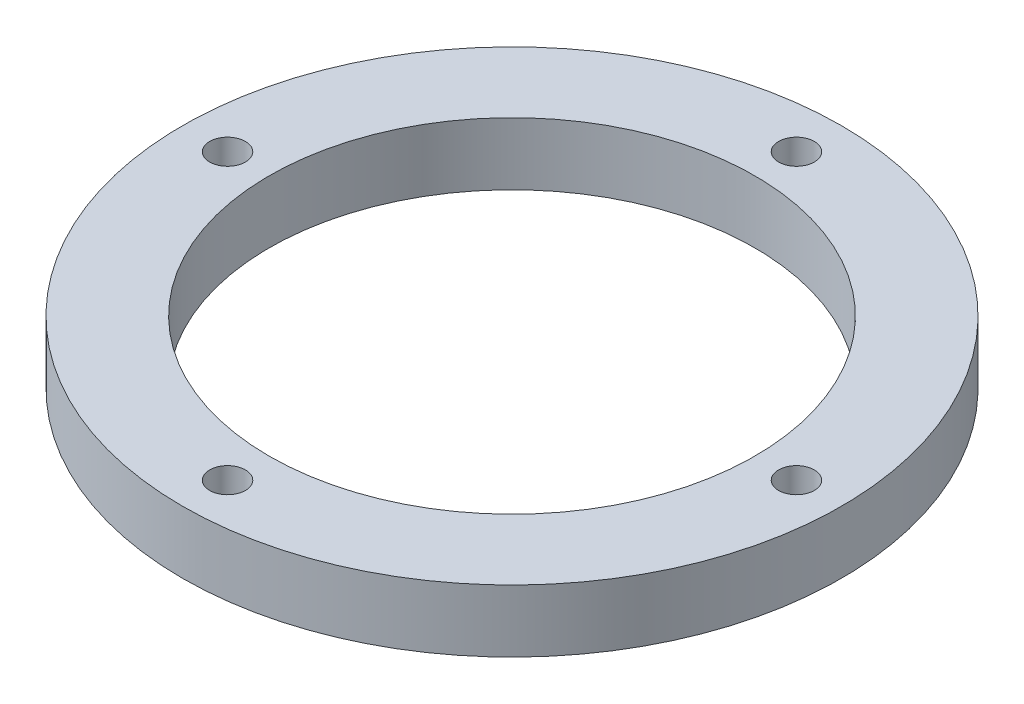
ISO-10303-21;
HEADER;
FILE_DESCRIPTION(('STEP AP214'),'2;1');
FILE_NAME('part.step','',(''),(''),'','','');
FILE_SCHEMA(('AUTOMOTIVE_DESIGN { 1 0 10303 214 1 1 1 1 }'));
ENDSEC;
DATA;
#1=APPLICATION_CONTEXT('core data for automotive mechanical design processes');
#2=APPLICATION_PROTOCOL_DEFINITION('international standard','automotive_design',2000,#1);
#3=PRODUCT_CONTEXT('',#1,'mechanical');
#4=PRODUCT('Part','Part','',(#3));
#5=PRODUCT_RELATED_PRODUCT_CATEGORY('part','',(#4));
#6=PRODUCT_DEFINITION_FORMATION('','',#4);
#7=PRODUCT_DEFINITION_CONTEXT('part definition',#1,'design');
#8=PRODUCT_DEFINITION('design','',#6,#7);
#9=PRODUCT_DEFINITION_SHAPE('','',#8);
#10=(LENGTH_UNIT() NAMED_UNIT(*) SI_UNIT(.MILLI.,.METRE.));
#11=(NAMED_UNIT(*) PLANE_ANGLE_UNIT() SI_UNIT($,.RADIAN.));
#12=(NAMED_UNIT(*) SI_UNIT($,.STERADIAN.) SOLID_ANGLE_UNIT());
#13=UNCERTAINTY_MEASURE_WITH_UNIT(LENGTH_MEASURE(1.E-05),#10,'distance_accuracy_value','');
#14=(GEOMETRIC_REPRESENTATION_CONTEXT(3) GLOBAL_UNCERTAINTY_ASSIGNED_CONTEXT((#13)) GLOBAL_UNIT_ASSIGNED_CONTEXT((#10,
#11,#12)) REPRESENTATION_CONTEXT('',''));
#15=CARTESIAN_POINT('',(0.,0.,0.));
#16=DIRECTION('',(0.,0.,1.));
#17=DIRECTION('',(1.,0.,0.));
#18=AXIS2_PLACEMENT_3D('',#15,#16,#17);
#19=CARTESIAN_POINT('',(0.,9.,0.));
#20=DIRECTION('',(0.,1.,0.));
#21=DIRECTION('',(0.,0.,1.));
#22=AXIS2_PLACEMENT_3D('',#19,#20,#21);
#23=PLANE('',#22);
#24=CARTESIAN_POINT('',(0.,9.,-41.));
#25=DIRECTION('',(0.,1.,0.));
#26=DIRECTION('',(0.,0.,1.));
#27=AXIS2_PLACEMENT_3D('',#24,#25,#26);
#28=CIRCLE('',#27,2.575);
#29=CARTESIAN_POINT('',(0.,9.,-38.425));
#30=VERTEX_POINT('',#29);
#31=EDGE_CURVE('E85',#30,#30,#28,.T.);
#32=ORIENTED_EDGE('',*,*,#31,.F.);
#33=EDGE_LOOP('',(#32));
#34=FACE_BOUND('',#33,.T.);
#35=CARTESIAN_POINT('',(41.,9.,1.42953470354697E-13));
#36=DIRECTION('',(0.,1.,0.));
#37=DIRECTION('',(0.,0.,1.));
#38=AXIS2_PLACEMENT_3D('',#35,#36,#37);
#39=CIRCLE('',#38,2.575);
#40=CARTESIAN_POINT('',(41.,9.,2.57500000000014));
#41=VERTEX_POINT('',#40);
#42=EDGE_CURVE('E81',#41,#41,#39,.T.);
#43=ORIENTED_EDGE('',*,*,#42,.F.);
#44=EDGE_LOOP('',(#43));
#45=FACE_BOUND('',#44,.T.);
#46=CARTESIAN_POINT('',(-2.86104205247266E-13,9.,41.));
#47=DIRECTION('',(0.,1.,0.));
#48=DIRECTION('',(0.,0.,1.));
#49=AXIS2_PLACEMENT_3D('',#46,#47,#48);
#50=CIRCLE('',#49,2.575);
#51=CARTESIAN_POINT('',(-2.86104205247266E-13,9.,43.575));
#52=VERTEX_POINT('',#51);
#53=EDGE_CURVE('E73',#52,#52,#50,.T.);
#54=ORIENTED_EDGE('',*,*,#53,.F.);
#55=EDGE_LOOP('',(#54));
#56=FACE_BOUND('',#55,.T.);
#57=CARTESIAN_POINT('',(-41.,9.,-4.29254940139834E-13));
#58=DIRECTION('',(0.,1.,0.));
#59=DIRECTION('',(0.,0.,1.));
#60=AXIS2_PLACEMENT_3D('',#57,#58,#59);
#61=CIRCLE('',#60,2.575);
#62=CARTESIAN_POINT('',(-41.,9.,2.57499999999957));
#63=VERTEX_POINT('',#62);
#64=EDGE_CURVE('E64',#63,#63,#61,.T.);
#65=ORIENTED_EDGE('',*,*,#64,.F.);
#66=EDGE_LOOP('',(#65));
#67=FACE_BOUND('',#66,.T.);
#68=CARTESIAN_POINT('',(0.,9.,0.));
#69=DIRECTION('',(0.,1.,0.));
#70=DIRECTION('',(0.,0.,1.));
#71=AXIS2_PLACEMENT_3D('',#68,#69,#70);
#72=CIRCLE('',#71,47.5);
#73=CARTESIAN_POINT('',(0.,9.,47.5));
#74=VERTEX_POINT('',#73);
#75=EDGE_CURVE('E10',#74,#74,#72,.T.);
#76=ORIENTED_EDGE('',*,*,#75,.T.);
#77=EDGE_LOOP('',(#76));
#78=FACE_BOUND('',#77,.T.);
#79=CARTESIAN_POINT('',(0.,9.,0.));
#80=DIRECTION('',(0.,1.,0.));
#81=DIRECTION('',(0.,0.,1.));
#82=AXIS2_PLACEMENT_3D('',#79,#80,#81);
#83=CIRCLE('',#82,35.);
#84=CARTESIAN_POINT('',(0.,9.,35.));
#85=VERTEX_POINT('',#84);
#86=EDGE_CURVE('E54',#85,#85,#83,.T.);
#87=ORIENTED_EDGE('',*,*,#86,.F.);
#88=EDGE_LOOP('',(#87));
#89=FACE_BOUND('',#88,.T.);
#90=ADVANCED_FACE('F41',(#34,#45,#56,#67,#78,#89),#23,.T.);
#91=CARTESIAN_POINT('',(0.,0.,0.));
#92=DIRECTION('',(0.,1.,0.));
#93=DIRECTION('',(0.,0.,1.));
#94=AXIS2_PLACEMENT_3D('',#91,#92,#93);
#95=PLANE('',#94);
#96=CARTESIAN_POINT('',(0.,0.,-41.));
#97=DIRECTION('',(0.,1.,0.));
#98=DIRECTION('',(0.,0.,1.));
#99=AXIS2_PLACEMENT_3D('',#96,#97,#98);
#100=CIRCLE('',#99,2.575);
#101=CARTESIAN_POINT('',(0.,0.,-38.425));
#102=VERTEX_POINT('',#101);
#103=EDGE_CURVE('E60',#102,#102,#100,.F.);
#104=ORIENTED_EDGE('',*,*,#103,.F.);
#105=EDGE_LOOP('',(#104));
#106=FACE_BOUND('',#105,.T.);
#107=CARTESIAN_POINT('',(41.,0.,1.42953470354697E-13));
#108=DIRECTION('',(0.,1.,0.));
#109=DIRECTION('',(0.,0.,1.));
#110=AXIS2_PLACEMENT_3D('',#107,#108,#109);
#111=CIRCLE('',#110,2.575);
#112=CARTESIAN_POINT('',(41.,0.,2.57500000000014));
#113=VERTEX_POINT('',#112);
#114=EDGE_CURVE('E77',#113,#113,#111,.F.);
#115=ORIENTED_EDGE('',*,*,#114,.F.);
#116=EDGE_LOOP('',(#115));
#117=FACE_BOUND('',#116,.T.);
#118=CARTESIAN_POINT('',(-2.86104205247266E-13,0.,41.));
#119=DIRECTION('',(0.,1.,0.));
#120=DIRECTION('',(0.,0.,1.));
#121=AXIS2_PLACEMENT_3D('',#118,#119,#120);
#122=CIRCLE('',#121,2.575);
#123=CARTESIAN_POINT('',(-2.86104205247266E-13,0.,43.575));
#124=VERTEX_POINT('',#123);
#125=EDGE_CURVE('E68',#124,#124,#122,.F.);
#126=ORIENTED_EDGE('',*,*,#125,.F.);
#127=EDGE_LOOP('',(#126));
#128=FACE_BOUND('',#127,.T.);
#129=CARTESIAN_POINT('',(-41.,0.,-4.29254940139834E-13));
#130=DIRECTION('',(0.,1.,0.));
#131=DIRECTION('',(0.,0.,1.));
#132=AXIS2_PLACEMENT_3D('',#129,#130,#131);
#133=CIRCLE('',#132,2.575);
#134=CARTESIAN_POINT('',(-41.,0.,2.57499999999957));
#135=VERTEX_POINT('',#134);
#136=EDGE_CURVE('E69',#135,#135,#133,.F.);
#137=ORIENTED_EDGE('',*,*,#136,.F.);
#138=EDGE_LOOP('',(#137));
#139=FACE_BOUND('',#138,.T.);
#140=CARTESIAN_POINT('',(0.,0.,0.));
#141=DIRECTION('',(0.,1.,0.));
#142=DIRECTION('',(0.,0.,1.));
#143=AXIS2_PLACEMENT_3D('',#140,#141,#142);
#144=CIRCLE('',#143,47.5);
#145=CARTESIAN_POINT('',(0.,0.,47.5));
#146=VERTEX_POINT('',#145);
#147=EDGE_CURVE('E45',#146,#146,#144,.T.);
#148=ORIENTED_EDGE('',*,*,#147,.F.);
#149=EDGE_LOOP('',(#148));
#150=FACE_BOUND('',#149,.T.);
#151=CARTESIAN_POINT('',(0.,0.,0.));
#152=DIRECTION('',(0.,1.,0.));
#153=DIRECTION('',(0.,0.,1.));
#154=AXIS2_PLACEMENT_3D('',#151,#152,#153);
#155=CIRCLE('',#154,35.);
#156=CARTESIAN_POINT('',(0.,0.,35.));
#157=VERTEX_POINT('',#156);
#158=EDGE_CURVE('E56',#157,#157,#155,.T.);
#159=ORIENTED_EDGE('',*,*,#158,.T.);
#160=EDGE_LOOP('',(#159));
#161=FACE_BOUND('',#160,.T.);
#162=ADVANCED_FACE('F101',(#106,#117,#128,#139,#150,#161),#95,.F.);
#163=CARTESIAN_POINT('',(0.,9.,0.));
#164=DIRECTION('',(0.,-1.,0.));
#165=DIRECTION('',(0.,0.,-1.));
#166=AXIS2_PLACEMENT_3D('',#163,#164,#165);
#167=CYLINDRICAL_SURFACE('',#166,47.5);
#168=ORIENTED_EDGE('',*,*,#75,.F.);
#169=EDGE_LOOP('',(#168));
#170=FACE_BOUND('',#169,.T.);
#171=ORIENTED_EDGE('',*,*,#147,.T.);
#172=EDGE_LOOP('',(#171));
#173=FACE_BOUND('',#172,.T.);
#174=ADVANCED_FACE('F43',(#170,#173),#167,.T.);
#175=CARTESIAN_POINT('',(0.,9.,0.));
#176=DIRECTION('',(0.,-1.,0.));
#177=DIRECTION('',(0.,0.,-1.));
#178=AXIS2_PLACEMENT_3D('',#175,#176,#177);
#179=CYLINDRICAL_SURFACE('',#178,35.);
#180=ORIENTED_EDGE('',*,*,#86,.T.);
#181=EDGE_LOOP('',(#180));
#182=FACE_BOUND('',#181,.T.);
#183=ORIENTED_EDGE('',*,*,#158,.F.);
#184=EDGE_LOOP('',(#183));
#185=FACE_BOUND('',#184,.T.);
#186=ADVANCED_FACE('F111',(#182,#185),#179,.F.);
#187=CARTESIAN_POINT('',(-41.,-0.000999999999999265,-4.29254940139834E-13));
#188=DIRECTION('',(0.,1.,0.));
#189=DIRECTION('',(0.,0.,1.));
#190=AXIS2_PLACEMENT_3D('',#187,#188,#189);
#191=CYLINDRICAL_SURFACE('',#190,2.575);
#192=ORIENTED_EDGE('',*,*,#64,.T.);
#193=EDGE_LOOP('',(#192));
#194=FACE_BOUND('',#193,.T.);
#195=ORIENTED_EDGE('',*,*,#136,.T.);
#196=EDGE_LOOP('',(#195));
#197=FACE_BOUND('',#196,.T.);
#198=ADVANCED_FACE('F114',(#194,#197),#191,.F.);
#199=CARTESIAN_POINT('',(-2.86104205247266E-13,-0.000999999999999265,41.));
#200=DIRECTION('',(0.,1.,0.));
#201=DIRECTION('',(0.,0.,1.));
#202=AXIS2_PLACEMENT_3D('',#199,#200,#201);
#203=CYLINDRICAL_SURFACE('',#202,2.575);
#204=ORIENTED_EDGE('',*,*,#53,.T.);
#205=EDGE_LOOP('',(#204));
#206=FACE_BOUND('',#205,.T.);
#207=ORIENTED_EDGE('',*,*,#125,.T.);
#208=EDGE_LOOP('',(#207));
#209=FACE_BOUND('',#208,.T.);
#210=ADVANCED_FACE('F129',(#206,#209),#203,.F.);
#211=CARTESIAN_POINT('',(41.,-0.000999999999999265,1.42953470354697E-13));
#212=DIRECTION('',(0.,1.,0.));
#213=DIRECTION('',(0.,0.,1.));
#214=AXIS2_PLACEMENT_3D('',#211,#212,#213);
#215=CYLINDRICAL_SURFACE('',#214,2.575);
#216=ORIENTED_EDGE('',*,*,#42,.T.);
#217=EDGE_LOOP('',(#216));
#218=FACE_BOUND('',#217,.T.);
#219=ORIENTED_EDGE('',*,*,#114,.T.);
#220=EDGE_LOOP('',(#219));
#221=FACE_BOUND('',#220,.T.);
#222=ADVANCED_FACE('F133',(#218,#221),#215,.F.);
#223=CARTESIAN_POINT('',(0.,-0.000999999999999265,-41.));
#224=DIRECTION('',(0.,1.,0.));
#225=DIRECTION('',(0.,0.,1.));
#226=AXIS2_PLACEMENT_3D('',#223,#224,#225);
#227=CYLINDRICAL_SURFACE('',#226,2.575);
#228=ORIENTED_EDGE('',*,*,#31,.T.);
#229=EDGE_LOOP('',(#228));
#230=FACE_BOUND('',#229,.T.);
#231=ORIENTED_EDGE('',*,*,#103,.T.);
#232=EDGE_LOOP('',(#231));
#233=FACE_BOUND('',#232,.T.);
#234=ADVANCED_FACE('F96',(#230,#233),#227,.F.);
#235=CLOSED_SHELL('',(#90,#162,#174,#186,#198,#210,#222,#234));
#236=MANIFOLD_SOLID_BREP('B2',#235);
#237=ADVANCED_BREP_SHAPE_REPRESENTATION('',(#18,#236),#14);
#238=SHAPE_DEFINITION_REPRESENTATION(#9,#237);
ENDSEC;
END-ISO-10303-21;
